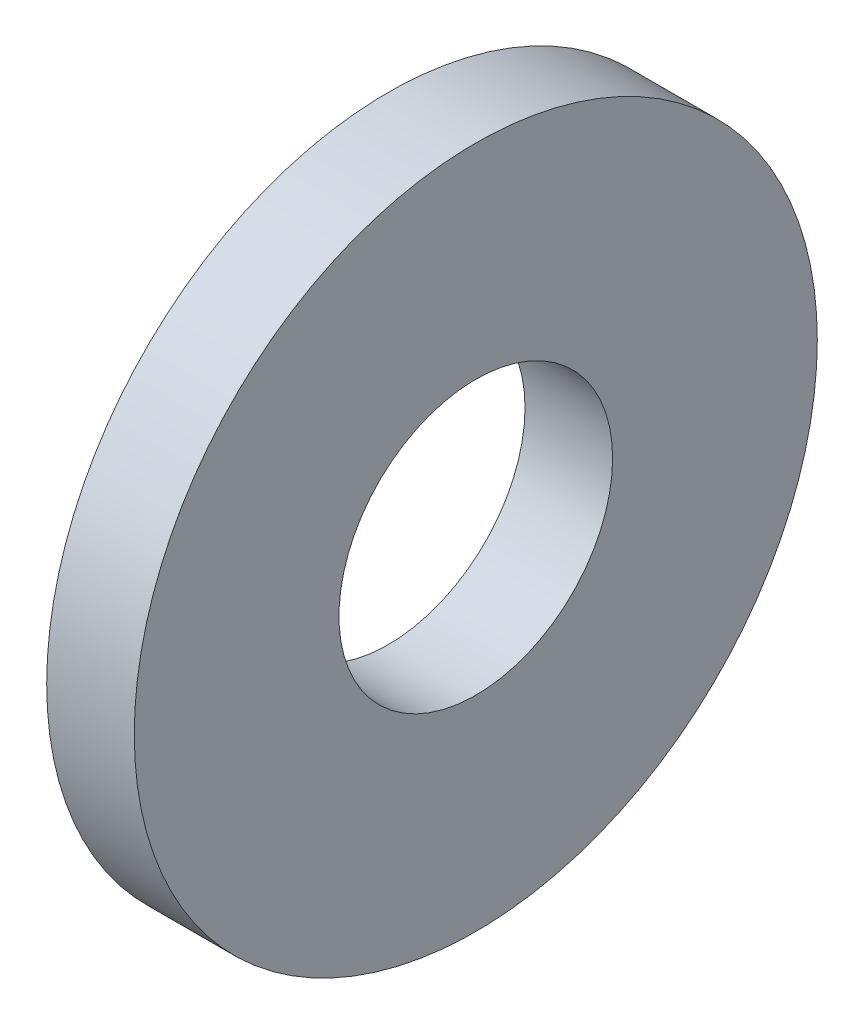
ISO-10303-21;
HEADER;
FILE_DESCRIPTION(('STEP AP214'),'2;1');
FILE_NAME('part.step','',(''),(''),'','','');
FILE_SCHEMA(('AUTOMOTIVE_DESIGN { 1 0 10303 214 1 1 1 1 }'));
ENDSEC;
DATA;
#1=APPLICATION_CONTEXT('core data for automotive mechanical design processes');
#2=APPLICATION_PROTOCOL_DEFINITION('international standard','automotive_design',2000,#1);
#3=PRODUCT_CONTEXT('',#1,'mechanical');
#4=PRODUCT('Part','Part','',(#3));
#5=PRODUCT_RELATED_PRODUCT_CATEGORY('part','',(#4));
#6=PRODUCT_DEFINITION_FORMATION('','',#4);
#7=PRODUCT_DEFINITION_CONTEXT('part definition',#1,'design');
#8=PRODUCT_DEFINITION('design','',#6,#7);
#9=PRODUCT_DEFINITION_SHAPE('','',#8);
#10=(LENGTH_UNIT() NAMED_UNIT(*) SI_UNIT(.MILLI.,.METRE.));
#11=(NAMED_UNIT(*) PLANE_ANGLE_UNIT() SI_UNIT($,.RADIAN.));
#12=(NAMED_UNIT(*) SI_UNIT($,.STERADIAN.) SOLID_ANGLE_UNIT());
#13=UNCERTAINTY_MEASURE_WITH_UNIT(LENGTH_MEASURE(1.E-05),#10,'distance_accuracy_value','');
#14=(GEOMETRIC_REPRESENTATION_CONTEXT(3) GLOBAL_UNCERTAINTY_ASSIGNED_CONTEXT((#13)) GLOBAL_UNIT_ASSIGNED_CONTEXT((#10,
#11,#12)) REPRESENTATION_CONTEXT('',''));
#15=CARTESIAN_POINT('',(0.,0.,0.));
#16=DIRECTION('',(0.,0.,1.));
#17=DIRECTION('',(1.,0.,0.));
#18=AXIS2_PLACEMENT_3D('',#15,#16,#17);
#19=CARTESIAN_POINT('',(1.016,0.,0.));
#20=DIRECTION('',(1.,0.,0.));
#21=DIRECTION('',(0.,0.,-1.));
#22=AXIS2_PLACEMENT_3D('',#19,#20,#21);
#23=PLANE('',#22);
#24=CARTESIAN_POINT('',(1.016,0.,0.));
#25=DIRECTION('',(1.,0.,0.));
#26=DIRECTION('',(0.,0.,-1.));
#27=AXIS2_PLACEMENT_3D('',#24,#25,#26);
#28=CIRCLE('',#27,3.9624);
#29=CARTESIAN_POINT('',(1.016,0.,-3.9624));
#30=VERTEX_POINT('',#29);
#31=EDGE_CURVE('E10',#30,#30,#28,.T.);
#32=ORIENTED_EDGE('',*,*,#31,.T.);
#33=EDGE_LOOP('',(#32));
#34=FACE_BOUND('',#33,.T.);
#35=CARTESIAN_POINT('',(1.016,0.,0.));
#36=DIRECTION('',(1.,0.,0.));
#37=DIRECTION('',(0.,0.,-1.));
#38=AXIS2_PLACEMENT_3D('',#35,#36,#37);
#39=CIRCLE('',#38,1.5875);
#40=CARTESIAN_POINT('',(1.016,0.,-1.5875));
#41=VERTEX_POINT('',#40);
#42=EDGE_CURVE('E46',#41,#41,#39,.T.);
#43=ORIENTED_EDGE('',*,*,#42,.F.);
#44=EDGE_LOOP('',(#43));
#45=FACE_BOUND('',#44,.T.);
#46=ADVANCED_FACE('F35',(#34,#45),#23,.T.);
#47=CARTESIAN_POINT('',(0.,0.,0.));
#48=DIRECTION('',(1.,0.,0.));
#49=DIRECTION('',(0.,0.,-1.));
#50=AXIS2_PLACEMENT_3D('',#47,#48,#49);
#51=PLANE('',#50);
#52=CARTESIAN_POINT('',(0.,0.,0.));
#53=DIRECTION('',(1.,0.,0.));
#54=DIRECTION('',(0.,0.,-1.));
#55=AXIS2_PLACEMENT_3D('',#52,#53,#54);
#56=CIRCLE('',#55,3.9624);
#57=CARTESIAN_POINT('',(0.,0.,-3.9624));
#58=VERTEX_POINT('',#57);
#59=EDGE_CURVE('E39',#58,#58,#56,.T.);
#60=ORIENTED_EDGE('',*,*,#59,.F.);
#61=EDGE_LOOP('',(#60));
#62=FACE_BOUND('',#61,.T.);
#63=CARTESIAN_POINT('',(0.,0.,0.));
#64=DIRECTION('',(1.,0.,0.));
#65=DIRECTION('',(0.,0.,-1.));
#66=AXIS2_PLACEMENT_3D('',#63,#64,#65);
#67=CIRCLE('',#66,1.5875);
#68=CARTESIAN_POINT('',(0.,0.,-1.5875));
#69=VERTEX_POINT('',#68);
#70=EDGE_CURVE('E48',#69,#69,#67,.T.);
#71=ORIENTED_EDGE('',*,*,#70,.T.);
#72=EDGE_LOOP('',(#71));
#73=FACE_BOUND('',#72,.T.);
#74=ADVANCED_FACE('F58',(#62,#73),#51,.F.);
#75=CARTESIAN_POINT('',(1.016,0.,0.));
#76=DIRECTION('',(-1.,0.,0.));
#77=DIRECTION('',(0.,0.,1.));
#78=AXIS2_PLACEMENT_3D('',#75,#76,#77);
#79=CYLINDRICAL_SURFACE('',#78,3.9624);
#80=ORIENTED_EDGE('',*,*,#31,.F.);
#81=EDGE_LOOP('',(#80));
#82=FACE_BOUND('',#81,.T.);
#83=ORIENTED_EDGE('',*,*,#59,.T.);
#84=EDGE_LOOP('',(#83));
#85=FACE_BOUND('',#84,.T.);
#86=ADVANCED_FACE('F37',(#82,#85),#79,.T.);
#87=CARTESIAN_POINT('',(1.016,0.,0.));
#88=DIRECTION('',(-1.,0.,0.));
#89=DIRECTION('',(0.,0.,1.));
#90=AXIS2_PLACEMENT_3D('',#87,#88,#89);
#91=CYLINDRICAL_SURFACE('',#90,1.5875);
#92=ORIENTED_EDGE('',*,*,#42,.T.);
#93=EDGE_LOOP('',(#92));
#94=FACE_BOUND('',#93,.T.);
#95=ORIENTED_EDGE('',*,*,#70,.F.);
#96=EDGE_LOOP('',(#95));
#97=FACE_BOUND('',#96,.T.);
#98=ADVANCED_FACE('F54',(#94,#97),#91,.F.);
#99=CLOSED_SHELL('',(#46,#74,#86,#98));
#100=MANIFOLD_SOLID_BREP('B2',#99);
#101=ADVANCED_BREP_SHAPE_REPRESENTATION('',(#18,#100),#14);
#102=SHAPE_DEFINITION_REPRESENTATION(#9,#101);
ENDSEC;
END-ISO-10303-21;
